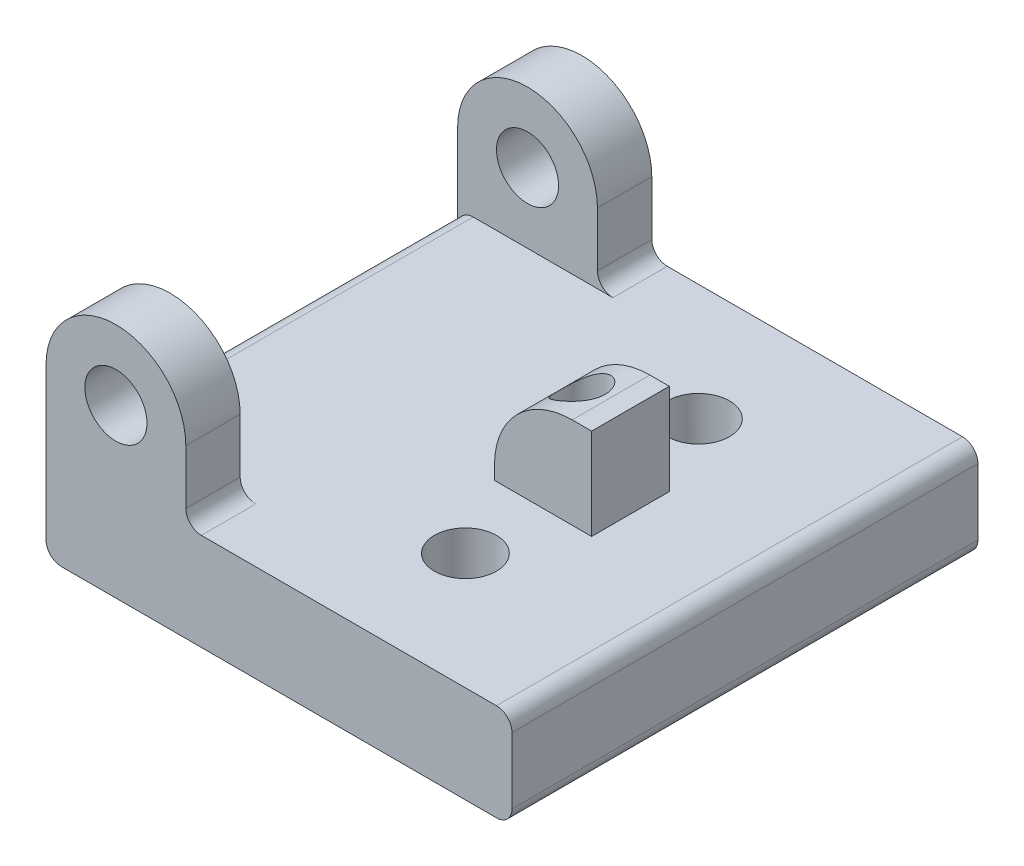
ISO-10303-21;
HEADER;
FILE_DESCRIPTION(('STEP AP214'),'2;1');
FILE_NAME('part.step','',(''),(''),'','','');
FILE_SCHEMA(('AUTOMOTIVE_DESIGN { 1 0 10303 214 1 1 1 1 }'));
ENDSEC;
DATA;
#1=APPLICATION_CONTEXT('core data for automotive mechanical design processes');
#2=APPLICATION_PROTOCOL_DEFINITION('international standard','automotive_design',2000,#1);
#3=PRODUCT_CONTEXT('',#1,'mechanical');
#4=PRODUCT('Part','Part','',(#3));
#5=PRODUCT_RELATED_PRODUCT_CATEGORY('part','',(#4));
#6=PRODUCT_DEFINITION_FORMATION('','',#4);
#7=PRODUCT_DEFINITION_CONTEXT('part definition',#1,'design');
#8=PRODUCT_DEFINITION('design','',#6,#7);
#9=PRODUCT_DEFINITION_SHAPE('','',#8);
#10=(LENGTH_UNIT() NAMED_UNIT(*) SI_UNIT(.MILLI.,.METRE.));
#11=(NAMED_UNIT(*) PLANE_ANGLE_UNIT() SI_UNIT($,.RADIAN.));
#12=(NAMED_UNIT(*) SI_UNIT($,.STERADIAN.) SOLID_ANGLE_UNIT());
#13=UNCERTAINTY_MEASURE_WITH_UNIT(LENGTH_MEASURE(1.E-05),#10,'distance_accuracy_value','');
#14=(GEOMETRIC_REPRESENTATION_CONTEXT(3) GLOBAL_UNCERTAINTY_ASSIGNED_CONTEXT((#13)) GLOBAL_UNIT_ASSIGNED_CONTEXT((#10,
#11,#12)) REPRESENTATION_CONTEXT('',''));
#15=CARTESIAN_POINT('',(0.,0.,0.));
#16=DIRECTION('',(0.,0.,1.));
#17=DIRECTION('',(1.,0.,0.));
#18=AXIS2_PLACEMENT_3D('',#15,#16,#17);
#19=CARTESIAN_POINT('',(19.,0.750000000000012,-7.));
#20=DIRECTION('',(0.,1.,0.));
#21=DIRECTION('',(-1.,0.,0.));
#22=AXIS2_PLACEMENT_3D('',#19,#20,#21);
#23=PLANE('',#22);
#24=CARTESIAN_POINT('',(0.,0.750000000000006,-45.));
#25=DIRECTION('',(0.,1.,0.));
#26=DIRECTION('',(-1.,0.,0.));
#27=AXIS2_PLACEMENT_3D('',#24,#25,#26);
#28=CIRCLE('',#27,4.);
#29=CARTESIAN_POINT('',(-4.,0.750000000000004,-45.));
#30=VERTEX_POINT('',#29);
#31=EDGE_CURVE('E225',#30,#30,#28,.T.);
#32=ORIENTED_EDGE('',*,*,#31,.F.);
#33=EDGE_LOOP('',(#32));
#34=FACE_BOUND('',#33,.T.);
#35=CARTESIAN_POINT('',(0.,0.750000000000006,-15.));
#36=DIRECTION('',(0.,1.,0.));
#37=DIRECTION('',(-1.,0.,0.));
#38=AXIS2_PLACEMENT_3D('',#35,#36,#37);
#39=CIRCLE('',#38,4.);
#40=CARTESIAN_POINT('',(-4.,0.750000000000004,-15.));
#41=VERTEX_POINT('',#40);
#42=EDGE_CURVE('E220',#41,#41,#39,.T.);
#43=ORIENTED_EDGE('',*,*,#42,.F.);
#44=EDGE_LOOP('',(#43));
#45=FACE_BOUND('',#44,.T.);
#46=DIRECTION('',(-1.,0.,0.));
#47=VECTOR('',#46,1.);
#48=CARTESIAN_POINT('',(19.,0.750000000000012,0.));
#49=LINE('',#48,#47);
#50=CARTESIAN_POINT('',(19.,0.750000000000012,0.));
#51=VERTEX_POINT('',#50);
#52=CARTESIAN_POINT('',(-19.,0.749999999999998,0.));
#53=VERTEX_POINT('',#52);
#54=EDGE_CURVE('E338',#51,#53,#49,.T.);
#55=ORIENTED_EDGE('',*,*,#54,.F.);
#56=DIRECTION('',(0.,0.,1.));
#57=VECTOR('',#56,1.);
#58=CARTESIAN_POINT('',(19.,0.750000000000012,-7.));
#59=LINE('',#58,#57);
#60=CARTESIAN_POINT('',(19.,0.750000000000012,-60.));
#61=VERTEX_POINT('',#60);
#62=EDGE_CURVE('E353',#61,#51,#59,.T.);
#63=ORIENTED_EDGE('',*,*,#62,.F.);
#64=DIRECTION('',(-1.,0.,0.));
#65=VECTOR('',#64,1.);
#66=CARTESIAN_POINT('',(19.,0.750000000000012,-60.));
#67=LINE('',#66,#65);
#68=CARTESIAN_POINT('',(-19.,0.749999999999998,-60.));
#69=VERTEX_POINT('',#68);
#70=EDGE_CURVE('E253',#61,#69,#67,.T.);
#71=ORIENTED_EDGE('',*,*,#70,.T.);
#72=DIRECTION('',(0.,0.,-1.));
#73=VECTOR('',#72,1.);
#74=CARTESIAN_POINT('',(-19.,0.749999999999998,-53.));
#75=LINE('',#74,#73);
#76=CARTESIAN_POINT('',(-19.,0.749999999999997,-53.));
#77=VERTEX_POINT('',#76);
#78=EDGE_CURVE('E276',#77,#69,#75,.T.);
#79=ORIENTED_EDGE('',*,*,#78,.F.);
#80=DIRECTION('',(1.,0.,0.));
#81=VECTOR('',#80,1.);
#82=CARTESIAN_POINT('',(-19.,0.749999999999997,-53.));
#83=LINE('',#82,#81);
#84=CARTESIAN_POINT('',(-37.,0.749999999999998,-53.));
#85=VERTEX_POINT('',#84);
#86=EDGE_CURVE('E286',#85,#77,#83,.T.);
#87=ORIENTED_EDGE('',*,*,#86,.F.);
#88=DIRECTION('',(0.,0.,1.));
#89=VECTOR('',#88,1.);
#90=CARTESIAN_POINT('',(-37.,0.749999999999998,-30.));
#91=LINE('',#90,#89);
#92=CARTESIAN_POINT('',(-37.,0.749999999999998,-7.));
#93=VERTEX_POINT('',#92);
#94=EDGE_CURVE('E295',#85,#93,#91,.T.);
#95=ORIENTED_EDGE('',*,*,#94,.T.);
#96=DIRECTION('',(1.,0.,0.));
#97=VECTOR('',#96,1.);
#98=CARTESIAN_POINT('',(-19.,0.749999999999997,-7.));
#99=LINE('',#98,#97);
#100=CARTESIAN_POINT('',(-19.,0.749999999999998,-7.));
#101=VERTEX_POINT('',#100);
#102=EDGE_CURVE('E291',#93,#101,#99,.T.);
#103=ORIENTED_EDGE('',*,*,#102,.T.);
#104=DIRECTION('',(0.,0.,1.));
#105=VECTOR('',#104,1.);
#106=CARTESIAN_POINT('',(-19.,0.749999999999998,-7.));
#107=LINE('',#106,#105);
#108=EDGE_CURVE('E351',#101,#53,#107,.T.);
#109=ORIENTED_EDGE('',*,*,#108,.T.);
#110=EDGE_LOOP('',(#55,#63,#71,#79,#87,#95,#103,#109));
#111=FACE_BOUND('',#110,.T.);
#112=DIRECTION('',(-1.,0.,0.));
#113=VECTOR('',#112,1.);
#114=CARTESIAN_POINT('',(19.,0.750000000000012,-25.));
#115=LINE('',#114,#113);
#116=CARTESIAN_POINT('',(6.25,0.750000000000008,-25.));
#117=VERTEX_POINT('',#116);
#118=CARTESIAN_POINT('',(-6.25,0.750000000000006,-25.));
#119=VERTEX_POINT('',#118);
#120=EDGE_CURVE('E198',#117,#119,#115,.T.);
#121=ORIENTED_EDGE('',*,*,#120,.T.);
#122=DIRECTION('',(0.,0.,-1.));
#123=VECTOR('',#122,1.);
#124=CARTESIAN_POINT('',(-6.25,0.750000000000003,-7.));
#125=LINE('',#124,#123);
#126=CARTESIAN_POINT('',(-6.25,0.750000000000006,-35.));
#127=VERTEX_POINT('',#126);
#128=EDGE_CURVE('E371',#119,#127,#125,.T.);
#129=ORIENTED_EDGE('',*,*,#128,.T.);
#130=DIRECTION('',(1.,0.,0.));
#131=VECTOR('',#130,1.);
#132=CARTESIAN_POINT('',(19.,0.750000000000012,-35.));
#133=LINE('',#132,#131);
#134=CARTESIAN_POINT('',(6.25,0.750000000000008,-35.));
#135=VERTEX_POINT('',#134);
#136=EDGE_CURVE('E348',#127,#135,#133,.T.);
#137=ORIENTED_EDGE('',*,*,#136,.T.);
#138=DIRECTION('',(0.,0.,1.));
#139=VECTOR('',#138,1.);
#140=CARTESIAN_POINT('',(6.25,0.750000000000008,-7.));
#141=LINE('',#140,#139);
#142=EDGE_CURVE('E368',#135,#117,#141,.T.);
#143=ORIENTED_EDGE('',*,*,#142,.T.);
#144=EDGE_LOOP('',(#121,#129,#137,#143));
#145=FACE_BOUND('',#144,.T.);
#146=ADVANCED_FACE('F38',(#34,#45,#111,#145),#23,.T.);
#147=CARTESIAN_POINT('',(-30.,9.75,-7.));
#148=DIRECTION('',(0.,0.,1.));
#149=DIRECTION('',(1.,0.,0.));
#150=AXIS2_PLACEMENT_3D('',#147,#148,#149);
#151=PLANE('',#150);
#152=CARTESIAN_POINT('',(-30.,9.75,-7.));
#153=DIRECTION('',(0.,0.,1.));
#154=DIRECTION('',(1.,0.,0.));
#155=AXIS2_PLACEMENT_3D('',#152,#153,#154);
#156=CIRCLE('',#155,4.);
#157=CARTESIAN_POINT('',(-26.,9.75,-7.));
#158=VERTEX_POINT('',#157);
#159=EDGE_CURVE('E298',#158,#158,#156,.T.);
#160=ORIENTED_EDGE('',*,*,#159,.T.);
#161=EDGE_LOOP('',(#160));
#162=FACE_BOUND('',#161,.T.);
#163=CARTESIAN_POINT('',(-37.,-1.25000000000001,-7.));
#164=DIRECTION('',(0.,0.,-1.));
#165=DIRECTION('',(1.,0.,0.));
#166=AXIS2_PLACEMENT_3D('',#163,#164,#165);
#167=CIRCLE('',#166,2.);
#168=CARTESIAN_POINT('',(-39.,-1.24999999999999,-7.));
#169=VERTEX_POINT('',#168);
#170=EDGE_CURVE('E288',#169,#93,#167,.T.);
#171=ORIENTED_EDGE('',*,*,#170,.F.);
#172=DIRECTION('',(0.,-1.,0.));
#173=VECTOR('',#172,1.);
#174=CARTESIAN_POINT('',(-39.,9.75,-7.));
#175=LINE('',#174,#173);
#176=CARTESIAN_POINT('',(-39.,9.75,-7.));
#177=VERTEX_POINT('',#176);
#178=EDGE_CURVE('E307',#177,#169,#175,.T.);
#179=ORIENTED_EDGE('',*,*,#178,.F.);
#180=CARTESIAN_POINT('',(-30.,9.75,-7.));
#181=DIRECTION('',(0.,0.,1.));
#182=DIRECTION('',(1.,0.,0.));
#183=AXIS2_PLACEMENT_3D('',#180,#181,#182);
#184=CIRCLE('',#183,8.99999999999999);
#185=CARTESIAN_POINT('',(-21.,9.75,-7.));
#186=VERTEX_POINT('',#185);
#187=EDGE_CURVE('E304',#186,#177,#184,.T.);
#188=ORIENTED_EDGE('',*,*,#187,.F.);
#189=DIRECTION('',(0.,1.,0.));
#190=VECTOR('',#189,1.);
#191=CARTESIAN_POINT('',(-21.,2.75,-7.));
#192=LINE('',#191,#190);
#193=CARTESIAN_POINT('',(-21.,2.75,-7.));
#194=VERTEX_POINT('',#193);
#195=EDGE_CURVE('E314',#194,#186,#192,.T.);
#196=ORIENTED_EDGE('',*,*,#195,.F.);
#197=CARTESIAN_POINT('',(-19.,2.75,-7.));
#198=DIRECTION('',(0.,0.,-1.));
#199=DIRECTION('',(-1.,0.,0.));
#200=AXIS2_PLACEMENT_3D('',#197,#198,#199);
#201=CIRCLE('',#200,2.);
#202=EDGE_CURVE('E311',#101,#194,#201,.T.);
#203=ORIENTED_EDGE('',*,*,#202,.F.);
#204=ORIENTED_EDGE('',*,*,#102,.F.);
#205=EDGE_LOOP('',(#171,#179,#188,#196,#203,#204));
#206=FACE_BOUND('',#205,.T.);
#207=ADVANCED_FACE('F396',(#162,#206),#151,.F.);
#208=CARTESIAN_POINT('',(-30.,9.75,-7.));
#209=DIRECTION('',(0.,0.,1.));
#210=DIRECTION('',(1.,0.,0.));
#211=AXIS2_PLACEMENT_3D('',#208,#209,#210);
#212=CYLINDRICAL_SURFACE('',#211,8.99999999999999);
#213=CARTESIAN_POINT('',(-30.,9.75,0.));
#214=DIRECTION('',(0.,0.,1.));
#215=DIRECTION('',(1.,0.,0.));
#216=AXIS2_PLACEMENT_3D('',#213,#214,#215);
#217=CIRCLE('',#216,8.99999999999999);
#218=CARTESIAN_POINT('',(-21.,9.75,0.));
#219=VERTEX_POINT('',#218);
#220=CARTESIAN_POINT('',(-39.,9.75,0.));
#221=VERTEX_POINT('',#220);
#222=EDGE_CURVE('E301',#219,#221,#217,.T.);
#223=ORIENTED_EDGE('',*,*,#222,.F.);
#224=DIRECTION('',(0.,0.,1.));
#225=VECTOR('',#224,1.);
#226=CARTESIAN_POINT('',(-21.,9.75,-7.));
#227=LINE('',#226,#225);
#228=EDGE_CURVE('E346',#186,#219,#227,.T.);
#229=ORIENTED_EDGE('',*,*,#228,.F.);
#230=ORIENTED_EDGE('',*,*,#187,.T.);
#231=DIRECTION('',(0.,0.,1.));
#232=VECTOR('',#231,1.);
#233=CARTESIAN_POINT('',(-39.,9.75,-7.));
#234=LINE('',#233,#232);
#235=EDGE_CURVE('E317',#177,#221,#234,.T.);
#236=ORIENTED_EDGE('',*,*,#235,.T.);
#237=EDGE_LOOP('',(#223,#229,#230,#236));
#238=FACE_BOUND('',#237,.T.);
#239=ADVANCED_FACE('F402',(#238),#212,.T.);
#240=CARTESIAN_POINT('',(-21.,2.75,-7.));
#241=DIRECTION('',(1.,0.,0.));
#242=DIRECTION('',(0.,0.,-1.));
#243=AXIS2_PLACEMENT_3D('',#240,#241,#242);
#244=PLANE('',#243);
#245=DIRECTION('',(0.,1.,0.));
#246=VECTOR('',#245,1.);
#247=CARTESIAN_POINT('',(-21.,2.75,0.));
#248=LINE('',#247,#246);
#249=CARTESIAN_POINT('',(-21.,2.75,0.));
#250=VERTEX_POINT('',#249);
#251=EDGE_CURVE('E308',#250,#219,#248,.T.);
#252=ORIENTED_EDGE('',*,*,#251,.F.);
#253=DIRECTION('',(0.,0.,1.));
#254=VECTOR('',#253,1.);
#255=CARTESIAN_POINT('',(-21.,2.75,-7.));
#256=LINE('',#255,#254);
#257=EDGE_CURVE('E349',#194,#250,#256,.T.);
#258=ORIENTED_EDGE('',*,*,#257,.F.);
#259=ORIENTED_EDGE('',*,*,#195,.T.);
#260=ORIENTED_EDGE('',*,*,#228,.T.);
#261=EDGE_LOOP('',(#252,#258,#259,#260));
#262=FACE_BOUND('',#261,.T.);
#263=ADVANCED_FACE('F436',(#262),#244,.T.);
#264=CARTESIAN_POINT('',(-19.,2.75,-7.));
#265=DIRECTION('',(0.,0.,1.));
#266=DIRECTION('',(1.,0.,0.));
#267=AXIS2_PLACEMENT_3D('',#264,#265,#266);
#268=CYLINDRICAL_SURFACE('',#267,2.);
#269=CARTESIAN_POINT('',(-19.,2.75,0.));
#270=DIRECTION('',(0.,0.,-1.));
#271=DIRECTION('',(-1.,0.,0.));
#272=AXIS2_PLACEMENT_3D('',#269,#270,#271);
#273=CIRCLE('',#272,2.);
#274=EDGE_CURVE('E341',#53,#250,#273,.T.);
#275=ORIENTED_EDGE('',*,*,#274,.F.);
#276=ORIENTED_EDGE('',*,*,#108,.F.);
#277=ORIENTED_EDGE('',*,*,#202,.T.);
#278=ORIENTED_EDGE('',*,*,#257,.T.);
#279=EDGE_LOOP('',(#275,#276,#277,#278));
#280=FACE_BOUND('',#279,.T.);
#281=ADVANCED_FACE('F409',(#280),#268,.F.);
#282=CARTESIAN_POINT('',(19.,-1.24999999999999,-7.));
#283=DIRECTION('',(0.,0.,1.));
#284=DIRECTION('',(1.,0.,0.));
#285=AXIS2_PLACEMENT_3D('',#282,#283,#284);
#286=CYLINDRICAL_SURFACE('',#285,2.);
#287=CARTESIAN_POINT('',(19.,-1.24999999999999,0.));
#288=DIRECTION('',(0.,0.,1.));
#289=DIRECTION('',(1.,0.,0.));
#290=AXIS2_PLACEMENT_3D('',#287,#288,#289);
#291=CIRCLE('',#290,2.);
#292=CARTESIAN_POINT('',(21.,-1.24999999999999,0.));
#293=VERTEX_POINT('',#292);
#294=EDGE_CURVE('E335',#293,#51,#291,.T.);
#295=ORIENTED_EDGE('',*,*,#294,.F.);
#296=DIRECTION('',(0.,0.,1.));
#297=VECTOR('',#296,1.);
#298=CARTESIAN_POINT('',(21.,-1.24999999999999,-7.));
#299=LINE('',#298,#297);
#300=CARTESIAN_POINT('',(21.,-1.24999999999999,-60.));
#301=VERTEX_POINT('',#300);
#302=EDGE_CURVE('E355',#301,#293,#299,.T.);
#303=ORIENTED_EDGE('',*,*,#302,.F.);
#304=CARTESIAN_POINT('',(19.,-1.24999999999999,-60.));
#305=DIRECTION('',(0.,0.,1.));
#306=DIRECTION('',(1.,0.,0.));
#307=AXIS2_PLACEMENT_3D('',#304,#305,#306);
#308=CIRCLE('',#307,2.);
#309=EDGE_CURVE('E255',#301,#61,#308,.T.);
#310=ORIENTED_EDGE('',*,*,#309,.T.);
#311=ORIENTED_EDGE('',*,*,#62,.T.);
#312=EDGE_LOOP('',(#295,#303,#310,#311));
#313=FACE_BOUND('',#312,.T.);
#314=ADVANCED_FACE('F411',(#313),#286,.T.);
#315=CARTESIAN_POINT('',(21.,-9.75,-7.));
#316=DIRECTION('',(1.,0.,0.));
#317=DIRECTION('',(0.,0.,-1.));
#318=AXIS2_PLACEMENT_3D('',#315,#316,#317);
#319=PLANE('',#318);
#320=DIRECTION('',(0.,1.,0.));
#321=VECTOR('',#320,1.);
#322=CARTESIAN_POINT('',(21.,-9.75,0.));
#323=LINE('',#322,#321);
#324=CARTESIAN_POINT('',(21.,-9.75,0.));
#325=VERTEX_POINT('',#324);
#326=EDGE_CURVE('E332',#325,#293,#323,.T.);
#327=ORIENTED_EDGE('',*,*,#326,.F.);
#328=DIRECTION('',(0.,0.,1.));
#329=VECTOR('',#328,1.);
#330=CARTESIAN_POINT('',(21.,-9.75,-7.));
#331=LINE('',#330,#329);
#332=CARTESIAN_POINT('',(21.,-9.75,-60.));
#333=VERTEX_POINT('',#332);
#334=EDGE_CURVE('E357',#333,#325,#331,.T.);
#335=ORIENTED_EDGE('',*,*,#334,.F.);
#336=DIRECTION('',(0.,1.,0.));
#337=VECTOR('',#336,1.);
#338=CARTESIAN_POINT('',(21.,-9.75,-60.));
#339=LINE('',#338,#337);
#340=EDGE_CURVE('E258',#333,#301,#339,.T.);
#341=ORIENTED_EDGE('',*,*,#340,.T.);
#342=ORIENTED_EDGE('',*,*,#302,.T.);
#343=EDGE_LOOP('',(#327,#335,#341,#342));
#344=FACE_BOUND('',#343,.T.);
#345=ADVANCED_FACE('F414',(#344),#319,.T.);
#346=CARTESIAN_POINT('',(19.,-9.75,-7.));
#347=DIRECTION('',(0.,0.,1.));
#348=DIRECTION('',(1.,0.,0.));
#349=AXIS2_PLACEMENT_3D('',#346,#347,#348);
#350=CYLINDRICAL_SURFACE('',#349,2.);
#351=CARTESIAN_POINT('',(19.,-9.75,0.));
#352=DIRECTION('',(0.,0.,1.));
#353=DIRECTION('',(1.,0.,0.));
#354=AXIS2_PLACEMENT_3D('',#351,#352,#353);
#355=CIRCLE('',#354,2.);
#356=CARTESIAN_POINT('',(19.,-11.75,0.));
#357=VERTEX_POINT('',#356);
#358=EDGE_CURVE('E329',#357,#325,#355,.T.);
#359=ORIENTED_EDGE('',*,*,#358,.F.);
#360=DIRECTION('',(0.,0.,1.));
#361=VECTOR('',#360,1.);
#362=CARTESIAN_POINT('',(19.,-11.75,-7.));
#363=LINE('',#362,#361);
#364=CARTESIAN_POINT('',(19.,-11.75,-60.));
#365=VERTEX_POINT('',#364);
#366=EDGE_CURVE('E359',#365,#357,#363,.T.);
#367=ORIENTED_EDGE('',*,*,#366,.F.);
#368=CARTESIAN_POINT('',(19.,-9.75,-60.));
#369=DIRECTION('',(0.,0.,1.));
#370=DIRECTION('',(1.,0.,0.));
#371=AXIS2_PLACEMENT_3D('',#368,#369,#370);
#372=CIRCLE('',#371,2.);
#373=EDGE_CURVE('E261',#365,#333,#372,.T.);
#374=ORIENTED_EDGE('',*,*,#373,.T.);
#375=ORIENTED_EDGE('',*,*,#334,.T.);
#376=EDGE_LOOP('',(#359,#367,#374,#375));
#377=FACE_BOUND('',#376,.T.);
#378=ADVANCED_FACE('F418',(#377),#350,.T.);
#379=CARTESIAN_POINT('',(-37.,-11.75,-7.));
#380=DIRECTION('',(0.,-1.,0.));
#381=DIRECTION('',(1.,0.,0.));
#382=AXIS2_PLACEMENT_3D('',#379,#380,#381);
#383=PLANE('',#382);
#384=CARTESIAN_POINT('',(0.,-11.75,-45.));
#385=DIRECTION('',(0.,1.,0.));
#386=DIRECTION('',(0.,0.,1.));
#387=AXIS2_PLACEMENT_3D('',#384,#385,#386);
#388=CIRCLE('',#387,4.);
#389=CARTESIAN_POINT('',(0.,-11.75,-41.));
#390=VERTEX_POINT('',#389);
#391=EDGE_CURVE('E217',#390,#390,#388,.T.);
#392=ORIENTED_EDGE('',*,*,#391,.T.);
#393=EDGE_LOOP('',(#392));
#394=FACE_BOUND('',#393,.T.);
#395=CARTESIAN_POINT('',(0.,-11.75,-15.));
#396=DIRECTION('',(0.,1.,0.));
#397=DIRECTION('',(0.,0.,1.));
#398=AXIS2_PLACEMENT_3D('',#395,#396,#397);
#399=CIRCLE('',#398,4.);
#400=CARTESIAN_POINT('',(0.,-11.75,-11.));
#401=VERTEX_POINT('',#400);
#402=EDGE_CURVE('E216',#401,#401,#399,.T.);
#403=ORIENTED_EDGE('',*,*,#402,.T.);
#404=EDGE_LOOP('',(#403));
#405=FACE_BOUND('',#404,.T.);
#406=DIRECTION('',(1.,0.,0.));
#407=VECTOR('',#406,1.);
#408=CARTESIAN_POINT('',(-37.,-11.75,0.));
#409=LINE('',#408,#407);
#410=CARTESIAN_POINT('',(-37.,-11.75,0.));
#411=VERTEX_POINT('',#410);
#412=EDGE_CURVE('E326',#411,#357,#409,.T.);
#413=ORIENTED_EDGE('',*,*,#412,.F.);
#414=DIRECTION('',(0.,0.,1.));
#415=VECTOR('',#414,1.);
#416=CARTESIAN_POINT('',(-37.,-11.75,-7.));
#417=LINE('',#416,#415);
#418=CARTESIAN_POINT('',(-37.,-11.75,-60.));
#419=VERTEX_POINT('',#418);
#420=EDGE_CURVE('E361',#419,#411,#417,.T.);
#421=ORIENTED_EDGE('',*,*,#420,.F.);
#422=DIRECTION('',(1.,0.,0.));
#423=VECTOR('',#422,1.);
#424=CARTESIAN_POINT('',(-37.,-11.75,-60.));
#425=LINE('',#424,#423);
#426=EDGE_CURVE('E264',#419,#365,#425,.T.);
#427=ORIENTED_EDGE('',*,*,#426,.T.);
#428=ORIENTED_EDGE('',*,*,#366,.T.);
#429=EDGE_LOOP('',(#413,#421,#427,#428));
#430=FACE_BOUND('',#429,.T.);
#431=ADVANCED_FACE('F422',(#394,#405,#430),#383,.T.);
#432=CARTESIAN_POINT('',(-37.,-9.75000000000001,-7.));
#433=DIRECTION('',(0.,0.,1.));
#434=DIRECTION('',(1.,0.,0.));
#435=AXIS2_PLACEMENT_3D('',#432,#433,#434);
#436=CYLINDRICAL_SURFACE('',#435,2.);
#437=CARTESIAN_POINT('',(-37.,-9.75000000000001,0.));
#438=DIRECTION('',(0.,0.,1.));
#439=DIRECTION('',(1.,0.,0.));
#440=AXIS2_PLACEMENT_3D('',#437,#438,#439);
#441=CIRCLE('',#440,2.);
#442=CARTESIAN_POINT('',(-39.,-9.75000000000001,0.));
#443=VERTEX_POINT('',#442);
#444=EDGE_CURVE('E323',#443,#411,#441,.T.);
#445=ORIENTED_EDGE('',*,*,#444,.F.);
#446=DIRECTION('',(0.,0.,1.));
#447=VECTOR('',#446,1.);
#448=CARTESIAN_POINT('',(-39.,-9.75000000000001,-7.));
#449=LINE('',#448,#447);
#450=CARTESIAN_POINT('',(-39.,-9.75000000000001,-60.));
#451=VERTEX_POINT('',#450);
#452=EDGE_CURVE('E363',#451,#443,#449,.T.);
#453=ORIENTED_EDGE('',*,*,#452,.F.);
#454=CARTESIAN_POINT('',(-37.,-9.75000000000001,-60.));
#455=DIRECTION('',(0.,0.,1.));
#456=DIRECTION('',(1.,0.,0.));
#457=AXIS2_PLACEMENT_3D('',#454,#455,#456);
#458=CIRCLE('',#457,2.);
#459=EDGE_CURVE('E267',#451,#419,#458,.T.);
#460=ORIENTED_EDGE('',*,*,#459,.T.);
#461=ORIENTED_EDGE('',*,*,#420,.T.);
#462=EDGE_LOOP('',(#445,#453,#460,#461));
#463=FACE_BOUND('',#462,.T.);
#464=ADVANCED_FACE('F426',(#463),#436,.T.);
#465=CARTESIAN_POINT('',(-39.,9.75,-7.));
#466=DIRECTION('',(-1.,0.,0.));
#467=DIRECTION('',(0.,-1.,0.));
#468=AXIS2_PLACEMENT_3D('',#465,#466,#467);
#469=PLANE('',#468);
#470=DIRECTION('',(0.,-1.,0.));
#471=VECTOR('',#470,1.);
#472=CARTESIAN_POINT('',(-39.,9.75,0.));
#473=LINE('',#472,#471);
#474=EDGE_CURVE('E320',#221,#443,#473,.T.);
#475=ORIENTED_EDGE('',*,*,#474,.F.);
#476=ORIENTED_EDGE('',*,*,#235,.F.);
#477=ORIENTED_EDGE('',*,*,#178,.T.);
#478=DIRECTION('',(0.,0.,1.));
#479=VECTOR('',#478,1.);
#480=CARTESIAN_POINT('',(-39.,-1.24999999999999,-30.));
#481=LINE('',#480,#479);
#482=CARTESIAN_POINT('',(-39.,-1.24999999999999,-53.));
#483=VERTEX_POINT('',#482);
#484=EDGE_CURVE('E293',#483,#169,#481,.T.);
#485=ORIENTED_EDGE('',*,*,#484,.F.);
#486=DIRECTION('',(0.,-1.,0.));
#487=VECTOR('',#486,1.);
#488=CARTESIAN_POINT('',(-39.,9.75,-53.));
#489=LINE('',#488,#487);
#490=CARTESIAN_POINT('',(-39.,9.75,-53.));
#491=VERTEX_POINT('',#490);
#492=EDGE_CURVE('E243',#491,#483,#489,.T.);
#493=ORIENTED_EDGE('',*,*,#492,.F.);
#494=DIRECTION('',(0.,0.,-1.));
#495=VECTOR('',#494,1.);
#496=CARTESIAN_POINT('',(-39.,9.75,-53.));
#497=LINE('',#496,#495);
#498=CARTESIAN_POINT('',(-39.,9.75,-60.));
#499=VERTEX_POINT('',#498);
#500=EDGE_CURVE('E272',#491,#499,#497,.T.);
#501=ORIENTED_EDGE('',*,*,#500,.T.);
#502=DIRECTION('',(0.,-1.,0.));
#503=VECTOR('',#502,1.);
#504=CARTESIAN_POINT('',(-39.,9.75,-60.));
#505=LINE('',#504,#503);
#506=EDGE_CURVE('E239',#499,#451,#505,.T.);
#507=ORIENTED_EDGE('',*,*,#506,.T.);
#508=ORIENTED_EDGE('',*,*,#452,.T.);
#509=EDGE_LOOP('',(#475,#476,#477,#485,#493,#501,#507,#508));
#510=FACE_BOUND('',#509,.T.);
#511=ADVANCED_FACE('F430',(#510),#469,.T.);
#512=CARTESIAN_POINT('',(-30.,9.75,0.));
#513=DIRECTION('',(0.,0.,1.));
#514=DIRECTION('',(1.,0.,0.));
#515=AXIS2_PLACEMENT_3D('',#512,#513,#514);
#516=PLANE('',#515);
#517=CARTESIAN_POINT('',(-30.,9.75,0.));
#518=DIRECTION('',(0.,0.,1.));
#519=DIRECTION('',(1.,0.,0.));
#520=AXIS2_PLACEMENT_3D('',#517,#518,#519);
#521=CIRCLE('',#520,4.);
#522=CARTESIAN_POINT('',(-26.,9.75,0.));
#523=VERTEX_POINT('',#522);
#524=EDGE_CURVE('E297',#523,#523,#521,.T.);
#525=ORIENTED_EDGE('',*,*,#524,.F.);
#526=EDGE_LOOP('',(#525));
#527=FACE_BOUND('',#526,.T.);
#528=ORIENTED_EDGE('',*,*,#222,.T.);
#529=ORIENTED_EDGE('',*,*,#474,.T.);
#530=ORIENTED_EDGE('',*,*,#444,.T.);
#531=ORIENTED_EDGE('',*,*,#412,.T.);
#532=ORIENTED_EDGE('',*,*,#358,.T.);
#533=ORIENTED_EDGE('',*,*,#326,.T.);
#534=ORIENTED_EDGE('',*,*,#294,.T.);
#535=ORIENTED_EDGE('',*,*,#54,.T.);
#536=ORIENTED_EDGE('',*,*,#274,.T.);
#537=ORIENTED_EDGE('',*,*,#251,.T.);
#538=EDGE_LOOP('',(#528,#529,#530,#531,#532,#533,#534,#535,#536,#537));
#539=FACE_BOUND('',#538,.T.);
#540=ADVANCED_FACE('F433',(#527,#539),#516,.T.);
#541=CARTESIAN_POINT('',(-30.,9.75,-7.));
#542=DIRECTION('',(0.,0.,1.));
#543=DIRECTION('',(1.,0.,0.));
#544=AXIS2_PLACEMENT_3D('',#541,#542,#543);
#545=CYLINDRICAL_SURFACE('',#544,4.);
#546=ORIENTED_EDGE('',*,*,#159,.F.);
#547=EDGE_LOOP('',(#546));
#548=FACE_BOUND('',#547,.T.);
#549=ORIENTED_EDGE('',*,*,#524,.T.);
#550=EDGE_LOOP('',(#549));
#551=FACE_BOUND('',#550,.T.);
#552=ADVANCED_FACE('F510',(#548,#551),#545,.F.);
#553=CARTESIAN_POINT('',(-37.,-1.25000000000001,-30.));
#554=DIRECTION('',(0.,0.,1.));
#555=DIRECTION('',(1.,0.,0.));
#556=AXIS2_PLACEMENT_3D('',#553,#554,#555);
#557=CYLINDRICAL_SURFACE('',#556,2.);
#558=ORIENTED_EDGE('',*,*,#170,.T.);
#559=ORIENTED_EDGE('',*,*,#94,.F.);
#560=CARTESIAN_POINT('',(-37.,-1.25000000000001,-53.));
#561=DIRECTION('',(0.,0.,-1.));
#562=DIRECTION('',(1.,0.,0.));
#563=AXIS2_PLACEMENT_3D('',#560,#561,#562);
#564=CIRCLE('',#563,2.);
#565=EDGE_CURVE('E275',#483,#85,#564,.T.);
#566=ORIENTED_EDGE('',*,*,#565,.F.);
#567=ORIENTED_EDGE('',*,*,#484,.T.);
#568=EDGE_LOOP('',(#558,#559,#566,#567));
#569=FACE_BOUND('',#568,.T.);
#570=ADVANCED_FACE('F518',(#569),#557,.T.);
#571=CARTESIAN_POINT('',(-30.,9.75,-53.));
#572=DIRECTION('',(0.,0.,-1.));
#573=DIRECTION('',(1.,0.,0.));
#574=AXIS2_PLACEMENT_3D('',#571,#572,#573);
#575=PLANE('',#574);
#576=ORIENTED_EDGE('',*,*,#492,.T.);
#577=ORIENTED_EDGE('',*,*,#565,.T.);
#578=ORIENTED_EDGE('',*,*,#86,.T.);
#579=CARTESIAN_POINT('',(-19.,2.75,-53.));
#580=DIRECTION('',(0.,0.,-1.));
#581=DIRECTION('',(-1.,0.,0.));
#582=AXIS2_PLACEMENT_3D('',#579,#580,#581);
#583=CIRCLE('',#582,2.);
#584=CARTESIAN_POINT('',(-21.,2.75,-53.));
#585=VERTEX_POINT('',#584);
#586=EDGE_CURVE('E241',#77,#585,#583,.T.);
#587=ORIENTED_EDGE('',*,*,#586,.T.);
#588=DIRECTION('',(0.,1.,0.));
#589=VECTOR('',#588,1.);
#590=CARTESIAN_POINT('',(-21.,2.75,-53.));
#591=LINE('',#590,#589);
#592=CARTESIAN_POINT('',(-21.,9.75,-53.));
#593=VERTEX_POINT('',#592);
#594=EDGE_CURVE('E238',#585,#593,#591,.T.);
#595=ORIENTED_EDGE('',*,*,#594,.T.);
#596=CARTESIAN_POINT('',(-30.,9.75,-53.));
#597=DIRECTION('',(0.,0.,1.));
#598=DIRECTION('',(1.,0.,0.));
#599=AXIS2_PLACEMENT_3D('',#596,#597,#598);
#600=CIRCLE('',#599,8.99999999999999);
#601=EDGE_CURVE('E235',#593,#491,#600,.T.);
#602=ORIENTED_EDGE('',*,*,#601,.T.);
#603=EDGE_LOOP('',(#576,#577,#578,#587,#595,#602));
#604=FACE_BOUND('',#603,.T.);
#605=CARTESIAN_POINT('',(-30.,9.75,-53.));
#606=DIRECTION('',(0.,0.,1.));
#607=DIRECTION('',(1.,0.,0.));
#608=AXIS2_PLACEMENT_3D('',#605,#606,#607);
#609=CIRCLE('',#608,4.);
#610=CARTESIAN_POINT('',(-26.,9.75,-53.));
#611=VERTEX_POINT('',#610);
#612=EDGE_CURVE('E229',#611,#611,#609,.T.);
#613=ORIENTED_EDGE('',*,*,#612,.F.);
#614=EDGE_LOOP('',(#613));
#615=FACE_BOUND('',#614,.T.);
#616=ADVANCED_FACE('F525',(#604,#615),#575,.F.);
#617=CARTESIAN_POINT('',(-30.,9.75,-60.));
#618=DIRECTION('',(0.,0.,-1.));
#619=DIRECTION('',(1.,0.,0.));
#620=AXIS2_PLACEMENT_3D('',#617,#618,#619);
#621=PLANE('',#620);
#622=CARTESIAN_POINT('',(-30.,9.75,-60.));
#623=DIRECTION('',(0.,0.,1.));
#624=DIRECTION('',(1.,0.,0.));
#625=AXIS2_PLACEMENT_3D('',#622,#623,#624);
#626=CIRCLE('',#625,8.99999999999999);
#627=CARTESIAN_POINT('',(-21.,9.75,-60.));
#628=VERTEX_POINT('',#627);
#629=EDGE_CURVE('E232',#628,#499,#626,.T.);
#630=ORIENTED_EDGE('',*,*,#629,.F.);
#631=DIRECTION('',(0.,1.,0.));
#632=VECTOR('',#631,1.);
#633=CARTESIAN_POINT('',(-21.,2.75,-60.));
#634=LINE('',#633,#632);
#635=CARTESIAN_POINT('',(-21.,2.75,-60.));
#636=VERTEX_POINT('',#635);
#637=EDGE_CURVE('E249',#636,#628,#634,.T.);
#638=ORIENTED_EDGE('',*,*,#637,.F.);
#639=CARTESIAN_POINT('',(-19.,2.75,-60.));
#640=DIRECTION('',(0.,0.,-1.));
#641=DIRECTION('',(-1.,0.,0.));
#642=AXIS2_PLACEMENT_3D('',#639,#640,#641);
#643=CIRCLE('',#642,2.);
#644=EDGE_CURVE('E251',#69,#636,#643,.T.);
#645=ORIENTED_EDGE('',*,*,#644,.F.);
#646=ORIENTED_EDGE('',*,*,#70,.F.);
#647=ORIENTED_EDGE('',*,*,#309,.F.);
#648=ORIENTED_EDGE('',*,*,#340,.F.);
#649=ORIENTED_EDGE('',*,*,#373,.F.);
#650=ORIENTED_EDGE('',*,*,#426,.F.);
#651=ORIENTED_EDGE('',*,*,#459,.F.);
#652=ORIENTED_EDGE('',*,*,#506,.F.);
#653=EDGE_LOOP('',(#630,#638,#645,#646,#647,#648,#649,#650,#651,#652));
#654=FACE_BOUND('',#653,.T.);
#655=CARTESIAN_POINT('',(-30.,9.75,-60.));
#656=DIRECTION('',(0.,0.,1.));
#657=DIRECTION('',(1.,0.,0.));
#658=AXIS2_PLACEMENT_3D('',#655,#656,#657);
#659=CIRCLE('',#658,4.);
#660=CARTESIAN_POINT('',(-26.,9.75,-60.));
#661=VERTEX_POINT('',#660);
#662=EDGE_CURVE('E228',#661,#661,#659,.T.);
#663=ORIENTED_EDGE('',*,*,#662,.T.);
#664=EDGE_LOOP('',(#663));
#665=FACE_BOUND('',#664,.T.);
#666=ADVANCED_FACE('F533',(#654,#665),#621,.T.);
#667=CARTESIAN_POINT('',(-30.,9.75,-53.));
#668=DIRECTION('',(0.,0.,-1.));
#669=DIRECTION('',(-1.,0.,0.));
#670=AXIS2_PLACEMENT_3D('',#667,#668,#669);
#671=CYLINDRICAL_SURFACE('',#670,8.99999999999999);
#672=ORIENTED_EDGE('',*,*,#629,.T.);
#673=ORIENTED_EDGE('',*,*,#500,.F.);
#674=ORIENTED_EDGE('',*,*,#601,.F.);
#675=DIRECTION('',(0.,0.,-1.));
#676=VECTOR('',#675,1.);
#677=CARTESIAN_POINT('',(-21.,9.75,-53.));
#678=LINE('',#677,#676);
#679=EDGE_CURVE('E246',#593,#628,#678,.T.);
#680=ORIENTED_EDGE('',*,*,#679,.T.);
#681=EDGE_LOOP('',(#672,#673,#674,#680));
#682=FACE_BOUND('',#681,.T.);
#683=ADVANCED_FACE('F541',(#682),#671,.T.);
#684=CARTESIAN_POINT('',(-19.,2.75,-53.));
#685=DIRECTION('',(0.,0.,-1.));
#686=DIRECTION('',(-1.,0.,0.));
#687=AXIS2_PLACEMENT_3D('',#684,#685,#686);
#688=CYLINDRICAL_SURFACE('',#687,2.);
#689=ORIENTED_EDGE('',*,*,#644,.T.);
#690=DIRECTION('',(0.,0.,-1.));
#691=VECTOR('',#690,1.);
#692=CARTESIAN_POINT('',(-21.,2.75,-53.));
#693=LINE('',#692,#691);
#694=EDGE_CURVE('E279',#585,#636,#693,.T.);
#695=ORIENTED_EDGE('',*,*,#694,.F.);
#696=ORIENTED_EDGE('',*,*,#586,.F.);
#697=ORIENTED_EDGE('',*,*,#78,.T.);
#698=EDGE_LOOP('',(#689,#695,#696,#697));
#699=FACE_BOUND('',#698,.T.);
#700=ADVANCED_FACE('F549',(#699),#688,.F.);
#701=CARTESIAN_POINT('',(-21.,2.75,-53.));
#702=DIRECTION('',(-1.,0.,0.));
#703=DIRECTION('',(0.,0.,1.));
#704=AXIS2_PLACEMENT_3D('',#701,#702,#703);
#705=PLANE('',#704);
#706=ORIENTED_EDGE('',*,*,#637,.T.);
#707=ORIENTED_EDGE('',*,*,#679,.F.);
#708=ORIENTED_EDGE('',*,*,#594,.F.);
#709=ORIENTED_EDGE('',*,*,#694,.T.);
#710=EDGE_LOOP('',(#706,#707,#708,#709));
#711=FACE_BOUND('',#710,.T.);
#712=ADVANCED_FACE('F557',(#711),#705,.F.);
#713=CARTESIAN_POINT('',(-30.,9.75,-53.));
#714=DIRECTION('',(0.,0.,-1.));
#715=DIRECTION('',(-1.,0.,0.));
#716=AXIS2_PLACEMENT_3D('',#713,#714,#715);
#717=CYLINDRICAL_SURFACE('',#716,4.);
#718=ORIENTED_EDGE('',*,*,#612,.T.);
#719=EDGE_LOOP('',(#718));
#720=FACE_BOUND('',#719,.T.);
#721=ORIENTED_EDGE('',*,*,#662,.F.);
#722=EDGE_LOOP('',(#721));
#723=FACE_BOUND('',#722,.T.);
#724=ADVANCED_FACE('F565',(#720,#723),#717,.F.);
#725=CARTESIAN_POINT('',(0.,-11.75,-15.));
#726=DIRECTION('',(0.,1.,0.));
#727=DIRECTION('',(0.,0.,1.));
#728=AXIS2_PLACEMENT_3D('',#725,#726,#727);
#729=CYLINDRICAL_SURFACE('',#728,4.);
#730=ORIENTED_EDGE('',*,*,#42,.T.);
#731=EDGE_LOOP('',(#730));
#732=FACE_BOUND('',#731,.T.);
#733=ORIENTED_EDGE('',*,*,#402,.F.);
#734=EDGE_LOOP('',(#733));
#735=FACE_BOUND('',#734,.T.);
#736=ADVANCED_FACE('F572',(#732,#735),#729,.F.);
#737=CARTESIAN_POINT('',(0.,-11.75,-45.));
#738=DIRECTION('',(0.,1.,0.));
#739=DIRECTION('',(0.,0.,1.));
#740=AXIS2_PLACEMENT_3D('',#737,#738,#739);
#741=CYLINDRICAL_SURFACE('',#740,4.);
#742=ORIENTED_EDGE('',*,*,#31,.T.);
#743=EDGE_LOOP('',(#742));
#744=FACE_BOUND('',#743,.T.);
#745=ORIENTED_EDGE('',*,*,#391,.F.);
#746=EDGE_LOOP('',(#745));
#747=FACE_BOUND('',#746,.T.);
#748=ADVANCED_FACE('F579',(#744,#747),#741,.F.);
#749=CARTESIAN_POINT('',(-6.25,12.5,-35.));
#750=DIRECTION('',(1.,0.,0.));
#751=DIRECTION('',(0.,0.,-1.));
#752=AXIS2_PLACEMENT_3D('',#749,#750,#751);
#753=PLANE('',#752);
#754=DIRECTION('',(0.,-1.,0.));
#755=VECTOR('',#754,1.);
#756=CARTESIAN_POINT('',(-6.25,12.5,-25.));
#757=LINE('',#756,#755);
#758=CARTESIAN_POINT('',(-6.25,2.5,-25.));
#759=VERTEX_POINT('',#758);
#760=EDGE_CURVE('E202',#759,#119,#757,.T.);
#761=ORIENTED_EDGE('',*,*,#760,.F.);
#762=DIRECTION('',(0.,0.,1.));
#763=VECTOR('',#762,1.);
#764=CARTESIAN_POINT('',(-6.25,2.5,-35.));
#765=LINE('',#764,#763);
#766=CARTESIAN_POINT('',(-6.25,2.5,-35.));
#767=VERTEX_POINT('',#766);
#768=EDGE_CURVE('E52',#759,#767,#765,.F.);
#769=ORIENTED_EDGE('',*,*,#768,.T.);
#770=DIRECTION('',(0.,-1.,0.));
#771=VECTOR('',#770,1.);
#772=CARTESIAN_POINT('',(-6.25,12.5,-35.));
#773=LINE('',#772,#771);
#774=EDGE_CURVE('E209',#767,#127,#773,.T.);
#775=ORIENTED_EDGE('',*,*,#774,.T.);
#776=ORIENTED_EDGE('',*,*,#128,.F.);
#777=EDGE_LOOP('',(#761,#769,#775,#776));
#778=FACE_BOUND('',#777,.T.);
#779=ADVANCED_FACE('F379',(#778),#753,.F.);
#780=CARTESIAN_POINT('',(-6.25,12.5,-25.));
#781=DIRECTION('',(0.,0.,-1.));
#782=DIRECTION('',(-1.,0.,0.));
#783=AXIS2_PLACEMENT_3D('',#780,#781,#782);
#784=PLANE('',#783);
#785=DIRECTION('',(1.,0.,0.));
#786=VECTOR('',#785,1.);
#787=CARTESIAN_POINT('',(-6.25,12.5,-25.));
#788=LINE('',#787,#786);
#789=CARTESIAN_POINT('',(3.75,12.5,-25.));
#790=VERTEX_POINT('',#789);
#791=CARTESIAN_POINT('',(6.25,12.5,-25.));
#792=VERTEX_POINT('',#791);
#793=EDGE_CURVE('E184',#790,#792,#788,.T.);
#794=ORIENTED_EDGE('',*,*,#793,.F.);
#795=CARTESIAN_POINT('',(3.75,2.5,-25.));
#796=DIRECTION('',(0.,0.,-1.));
#797=DIRECTION('',(-1.,0.,0.));
#798=AXIS2_PLACEMENT_3D('',#795,#796,#797);
#799=CIRCLE('',#798,10.);
#800=EDGE_CURVE('E66',#790,#759,#799,.F.);
#801=ORIENTED_EDGE('',*,*,#800,.T.);
#802=ORIENTED_EDGE('',*,*,#760,.T.);
#803=ORIENTED_EDGE('',*,*,#120,.F.);
#804=DIRECTION('',(0.,-1.,0.));
#805=VECTOR('',#804,1.);
#806=CARTESIAN_POINT('',(6.25,12.5,-25.));
#807=LINE('',#806,#805);
#808=EDGE_CURVE('E195',#792,#117,#807,.T.);
#809=ORIENTED_EDGE('',*,*,#808,.F.);
#810=EDGE_LOOP('',(#794,#801,#802,#803,#809));
#811=FACE_BOUND('',#810,.T.);
#812=ADVANCED_FACE('F196',(#811),#784,.F.);
#813=CARTESIAN_POINT('',(6.25,12.5,-35.));
#814=DIRECTION('',(-1.,0.,0.));
#815=DIRECTION('',(0.,0.,1.));
#816=AXIS2_PLACEMENT_3D('',#813,#814,#815);
#817=PLANE('',#816);
#818=ORIENTED_EDGE('',*,*,#142,.F.);
#819=DIRECTION('',(0.,-1.,0.));
#820=VECTOR('',#819,1.);
#821=CARTESIAN_POINT('',(6.25,12.5,-35.));
#822=LINE('',#821,#820);
#823=CARTESIAN_POINT('',(6.25,12.5,-35.));
#824=VERTEX_POINT('',#823);
#825=EDGE_CURVE('E203',#824,#135,#822,.T.);
#826=ORIENTED_EDGE('',*,*,#825,.F.);
#827=DIRECTION('',(0.,0.,-1.));
#828=VECTOR('',#827,1.);
#829=CARTESIAN_POINT('',(6.25,12.5,-35.));
#830=LINE('',#829,#828);
#831=EDGE_CURVE('E189',#792,#824,#830,.T.);
#832=ORIENTED_EDGE('',*,*,#831,.F.);
#833=ORIENTED_EDGE('',*,*,#808,.T.);
#834=EDGE_LOOP('',(#818,#826,#832,#833));
#835=FACE_BOUND('',#834,.T.);
#836=ADVANCED_FACE('F205',(#835),#817,.F.);
#837=CARTESIAN_POINT('',(-6.25,12.5,-35.));
#838=DIRECTION('',(0.,0.,1.));
#839=DIRECTION('',(1.,0.,0.));
#840=AXIS2_PLACEMENT_3D('',#837,#838,#839);
#841=PLANE('',#840);
#842=ORIENTED_EDGE('',*,*,#774,.F.);
#843=CARTESIAN_POINT('',(3.75,2.5,-35.));
#844=DIRECTION('',(0.,0.,1.));
#845=DIRECTION('',(1.,0.,0.));
#846=AXIS2_PLACEMENT_3D('',#843,#844,#845);
#847=CIRCLE('',#846,10.);
#848=CARTESIAN_POINT('',(3.75,12.5,-35.));
#849=VERTEX_POINT('',#848);
#850=EDGE_CURVE('E11',#767,#849,#847,.F.);
#851=ORIENTED_EDGE('',*,*,#850,.T.);
#852=DIRECTION('',(-1.,0.,0.));
#853=VECTOR('',#852,1.);
#854=CARTESIAN_POINT('',(-6.25,12.5,-35.));
#855=LINE('',#854,#853);
#856=EDGE_CURVE('E207',#824,#849,#855,.T.);
#857=ORIENTED_EDGE('',*,*,#856,.F.);
#858=ORIENTED_EDGE('',*,*,#825,.T.);
#859=ORIENTED_EDGE('',*,*,#136,.F.);
#860=EDGE_LOOP('',(#842,#851,#857,#858,#859));
#861=FACE_BOUND('',#860,.T.);
#862=ADVANCED_FACE('F382',(#861),#841,.F.);
#863=CARTESIAN_POINT('',(0.,12.5,0.));
#864=DIRECTION('',(0.,1.,0.));
#865=DIRECTION('',(0.,0.,1.));
#866=AXIS2_PLACEMENT_3D('',#863,#864,#865);
#867=PLANE('',#866);
#868=ORIENTED_EDGE('',*,*,#856,.T.);
#869=DIRECTION('',(0.,0.,1.));
#870=VECTOR('',#869,1.);
#871=CARTESIAN_POINT('',(3.75,12.5,-25.));
#872=LINE('',#871,#870);
#873=EDGE_CURVE('E192',#849,#790,#872,.T.);
#874=ORIENTED_EDGE('',*,*,#873,.T.);
#875=ORIENTED_EDGE('',*,*,#793,.T.);
#876=ORIENTED_EDGE('',*,*,#831,.T.);
#877=EDGE_LOOP('',(#868,#874,#875,#876));
#878=FACE_BOUND('',#877,.T.);
#879=ADVANCED_FACE('F187',(#878),#867,.T.);
#880=CARTESIAN_POINT('',(3.75,2.5,0.));
#881=DIRECTION('',(0.,0.,-1.));
#882=DIRECTION('',(-1.,0.,0.));
#883=AXIS2_PLACEMENT_3D('',#880,#881,#882);
#884=CYLINDRICAL_SURFACE('',#883,10.);
#885=CARTESIAN_POINT('',(0.,11.7702481088696,-27.));
#886=CARTESIAN_POINT('',(0.160518909679366,11.8351750007153,-27.0000070334989));
#887=CARTESIAN_POINT('',(0.322887148405465,11.8959662670365,-27.0129225039163));
#888=CARTESIAN_POINT('',(0.646717644950837,12.0078412473299,-27.0659402233972));
#889=CARTESIAN_POINT('',(0.808178872811857,12.0589155007803,-27.106068795539));
#890=CARTESIAN_POINT('',(1.12517496251486,12.1507812845594,-27.213953828672));
#891=CARTESIAN_POINT('',(1.28069589380298,12.1915497698977,-27.2817713360354));
#892=CARTESIAN_POINT('',(1.57974058072911,12.2628700443874,-27.4439606403832));
#893=CARTESIAN_POINT('',(1.72326813194859,12.2934250750763,-27.5383239947255));
#894=CARTESIAN_POINT('',(1.9873037334859,12.3443004561991,-27.7466247389912));
#895=CARTESIAN_POINT('',(2.10853057550518,12.3650003855463,-27.8595605290318));
#896=CARTESIAN_POINT('',(2.33114601543991,12.3994733153536,-28.104442472977));
#897=CARTESIAN_POINT('',(2.43253437188084,12.413246231501,-28.236388858245));
#898=CARTESIAN_POINT('',(2.61173033153176,12.4354152865014,-28.5147044833433));
#899=CARTESIAN_POINT('',(2.68967335353794,12.4438426273677,-28.6609841625641));
#900=CARTESIAN_POINT('',(2.82047549221234,12.4569234989115,-28.964513847978));
#901=CARTESIAN_POINT('',(2.87333364695358,12.4615768848742,-29.1217642746002));
#902=CARTESIAN_POINT('',(2.95289972657693,12.468262700356,-29.4447057466346));
#903=CARTESIAN_POINT('',(2.97930306436812,12.4702646855926,-29.6104725086968));
#904=CARTESIAN_POINT('',(3.00414053398417,12.4721538416854,-29.9441033052143));
#905=CARTESIAN_POINT('',(3.00257351492293,12.4720409255205,-30.1119674256851));
#906=CARTESIAN_POINT('',(2.97143167387827,12.4696575929567,-30.4459418236326));
#907=CARTESIAN_POINT('',(2.94171220693996,12.4673760340432,-30.6120385610647));
#908=CARTESIAN_POINT('',(2.85491645024222,12.459955099383,-30.9368630532157));
#909=CARTESIAN_POINT('',(2.79783979171537,12.454815685113,-31.0955907085696));
#910=CARTESIAN_POINT('',(2.65812515625355,12.440458145397,-31.4008961337164));
#911=CARTESIAN_POINT('',(2.5755244353448,12.4312459563619,-31.547491219882));
#912=CARTESIAN_POINT('',(2.3872830578976,12.4071676452907,-31.8245321765973));
#913=CARTESIAN_POINT('',(2.2816445994684,12.3923020625637,-31.9549795859918));
#914=CARTESIAN_POINT('',(2.0518235702528,12.3554339602842,-32.1948464390932));
#915=CARTESIAN_POINT('',(1.92782181932781,12.3334988190513,-32.3044494553722));
#916=CARTESIAN_POINT('',(1.66471645146311,12.2810810360373,-32.5011377902073));
#917=CARTESIAN_POINT('',(1.52561491641083,12.2505995716681,-32.5882262073859));
#918=CARTESIAN_POINT('',(1.23816965646201,12.1805163295557,-32.7373250676911));
#919=CARTESIAN_POINT('',(1.08990742178422,12.1409883330432,-32.7995277680021));
#920=CARTESIAN_POINT('',(0.787961033385065,12.0525427881722,-32.8990343377));
#921=CARTESIAN_POINT('',(0.634276323289474,12.0036242739976,-32.9363356442065));
#922=CARTESIAN_POINT('',(0.321673404766238,11.8954610661822,-32.9870231899609));
#923=CARTESIAN_POINT('',(0.162729732741386,11.8359642862424,-32.999706082733));
#924=CARTESIAN_POINT('',(-0.151902371623948,11.7089081374311,-33.0002841498145));
#925=CARTESIAN_POINT('',(-0.307589826823667,11.6413463880518,-32.988171988337));
#926=CARTESIAN_POINT('',(-0.625729082112557,11.493684491313,-32.9388085509595));
#927=CARTESIAN_POINT('',(-0.787582557674215,11.4130045663813,-32.8994523353661));
#928=CARTESIAN_POINT('',(-1.10042236785868,11.2467056127441,-32.7957594653423));
#929=CARTESIAN_POINT('',(-1.25140074425322,11.1610830479947,-32.7314047331798));
#930=CARTESIAN_POINT('',(-1.55703117336927,10.9776629638756,-32.5707721781128));
#931=CARTESIAN_POINT('',(-1.71003405697506,10.8796161103054,-32.4716338030192));
#932=CARTESIAN_POINT('',(-1.99659981925624,10.6857500842701,-32.2465083429637));
#933=CARTESIAN_POINT('',(-2.13016012062049,10.5899312085581,-32.120517703907));
#934=CARTESIAN_POINT('',(-2.35547514991148,10.4208493509116,-31.8644411718516));
#935=CARTESIAN_POINT('',(-2.45050101565173,10.3463933858619,-31.7380237905088));
#936=CARTESIAN_POINT('',(-2.62139660286871,10.2082647711926,-31.4675736257918));
#937=CARTESIAN_POINT('',(-2.69729695444317,10.1445749338436,-31.3235695643863));
#938=CARTESIAN_POINT('',(-2.81260269944381,10.045645991379,-31.0517667912511));
#939=CARTESIAN_POINT('',(-2.85633024336016,10.0072390104527,-30.9269687122767));
#940=CARTESIAN_POINT('',(-2.92738697433429,9.9441106562506,-30.6694695853779));
#941=CARTESIAN_POINT('',(-2.95473252676381,9.91937562681136,-30.5367765705899));
#942=CARTESIAN_POINT('',(-2.99131935582639,9.88615338107298,-30.2660107084002));
#943=CARTESIAN_POINT('',(-3.00045022131345,9.87776526112436,-30.1279101946115));
#944=CARTESIAN_POINT('',(-2.99951559680537,9.87862057380052,-29.8518368292494));
#945=CARTESIAN_POINT('',(-2.98945231700868,9.88786197639257,-29.7138639648074));
#946=CARTESIAN_POINT('',(-2.9527286212787,9.92118207843947,-29.4550929478828));
#947=CARTESIAN_POINT('',(-2.9276583449392,9.94383722348752,-29.3338729329704));
#948=CARTESIAN_POINT('',(-2.86378304200636,10.0006462352677,-29.097941270752));
#949=CARTESIAN_POINT('',(-2.8249687468586,10.0348078608653,-28.9832340762178));
#950=CARTESIAN_POINT('',(-2.71803501502539,10.1270041195175,-28.7195507122832));
#951=CARTESIAN_POINT('',(-2.6443852450319,10.189171495546,-28.5742637271651));
#952=CARTESIAN_POINT('',(-2.47777415871321,10.3247284654258,-28.3010789655317));
#953=CARTESIAN_POINT('',(-2.3847841311994,10.3981347004583,-28.1732075153048));
#954=CARTESIAN_POINT('',(-2.18062630894051,10.5525980609158,-27.9335888826956));
#955=CARTESIAN_POINT('',(-2.06917163625787,10.6337656567722,-27.8221592416462));
#956=CARTESIAN_POINT('',(-1.8314213074078,10.7987168263392,-27.618742744949));
#957=CARTESIAN_POINT('',(-1.70511863712658,10.8825016225673,-27.5267651362252));
#958=CARTESIAN_POINT('',(-1.41279382370915,11.0662715622563,-27.3468712096834));
#959=CARTESIAN_POINT('',(-1.24388744866539,11.1661333293857,-27.2634746454112));
#960=CARTESIAN_POINT('',(-0.890855527081986,11.360181983924,-27.1291308691126));
#961=CARTESIAN_POINT('',(-0.706761360811414,11.4543799099859,-27.0781185540214));
#962=CARTESIAN_POINT('',(-0.432992070622004,11.5835774337476,-27.0301707859572));
#963=CARTESIAN_POINT('',(-0.34748081829232,11.6224741855856,-27.018932593854));
#964=CARTESIAN_POINT('',(-0.174830508938538,11.6980749592391,-27.0038447332847));
#965=CARTESIAN_POINT('',(-0.0876912130794159,11.7347786559634,-26.9999961576113));
#966=CARTESIAN_POINT('',(0.,11.7702481088696,-27.));
#967=B_SPLINE_CURVE_WITH_KNOTS('',3,(#885,#886,#887,#888,#889,#890,#891,#892,#893,#894,#895,
#896,#897,#898,#899,#900,#901,#902,#903,#904,#905,#906,#907,#908,#909,#910,#911,#912,#913,#914,
#915,#916,#917,#918,#919,#920,#921,#922,#923,#924,#925,#926,#927,#928,#929,#930,#931,#932,#933,
#934,#935,#936,#937,#938,#939,#940,#941,#942,#943,#944,#945,#946,#947,#948,#949,#950,#951,#952,
#953,#954,#955,#956,#957,#958,#959,#960,#961,#962,#963,#964,#965,#966),.UNSPECIFIED.,.T.,.F.,(4,
2,2,2,2,2,2,2,2,2,2,2,2,2,2,2,2,2,2,2,2,2,2,2,2,2,2,2,2,2,2,2,2,2,2,2,2,2,2,2,4),(0.,
0.519134015655567,1.03877090430658,1.55955968744272,2.08018302578682,2.57869384310983,
3.07721072794091,3.57279033431115,4.06838894308958,4.56963022002886,5.07089212140809,
5.57474351427978,6.07860169912039,6.58172787731604,7.0848060715104,7.58322470307385,
8.08157470208766,8.57599664247525,9.07046946150433,9.57887269398471,10.0874263627903,
10.6404343152868,11.1938429234265,11.8122140384761,12.4306670503793,12.9531621159063,
13.4748149936171,13.8862966764301,14.2973666065563,14.7109208197257,15.1244274151612,
15.5003842113085,15.8765950258232,16.3968097343097,16.9178023010078,17.4478161732657,
17.9780814349957,18.6147676909997,19.250169909383,19.5337300274673,19.8173320758151),.UNSPECIFIED.);
#968=CARTESIAN_POINT('',(0.,11.7702481088696,-27.));
#969=VERTEX_POINT('',#968);
#970=EDGE_CURVE('E43',#969,#969,#967,.T.);
#971=ORIENTED_EDGE('',*,*,#970,.F.);
#972=EDGE_LOOP('',(#971));
#973=FACE_BOUND('',#972,.T.);
#974=ORIENTED_EDGE('',*,*,#850,.F.);
#975=ORIENTED_EDGE('',*,*,#768,.F.);
#976=ORIENTED_EDGE('',*,*,#800,.F.);
#977=ORIENTED_EDGE('',*,*,#873,.F.);
#978=EDGE_LOOP('',(#974,#975,#976,#977));
#979=FACE_BOUND('',#978,.T.);
#980=ADVANCED_FACE('F40',(#973,#979),#884,.T.);
#981=CARTESIAN_POINT('',(0.,-2.5,-30.));
#982=DIRECTION('',(0.,1.,0.));
#983=DIRECTION('',(0.,0.,1.));
#984=AXIS2_PLACEMENT_3D('',#981,#982,#983);
#985=CYLINDRICAL_SURFACE('',#984,3.);
#986=ORIENTED_EDGE('',*,*,#970,.T.);
#987=EDGE_LOOP('',(#986));
#988=FACE_BOUND('',#987,.T.);
#989=CARTESIAN_POINT('',(0.,-2.5,-30.));
#990=DIRECTION('',(0.,1.,0.));
#991=DIRECTION('',(0.,0.,1.));
#992=AXIS2_PLACEMENT_3D('',#989,#990,#991);
#993=CIRCLE('',#992,3.);
#994=CARTESIAN_POINT('',(0.,-2.5,-27.));
#995=VERTEX_POINT('',#994);
#996=EDGE_CURVE('E642',#995,#995,#993,.T.);
#997=ORIENTED_EDGE('',*,*,#996,.F.);
#998=EDGE_LOOP('',(#997));
#999=FACE_BOUND('',#998,.T.);
#1000=ADVANCED_FACE('F385',(#988,#999),#985,.F.);
#1001=CARTESIAN_POINT('',(0.,-2.5,-30.));
#1002=DIRECTION('',(0.,1.,0.));
#1003=DIRECTION('',(0.,0.,1.));
#1004=AXIS2_PLACEMENT_3D('',#1001,#1002,#1003);
#1005=PLANE('',#1004);
#1006=ORIENTED_EDGE('',*,*,#996,.T.);
#1007=EDGE_LOOP('',(#1006));
#1008=FACE_BOUND('',#1007,.T.);
#1009=ADVANCED_FACE('F391',(#1008),#1005,.T.);
#1010=CLOSED_SHELL('',(#146,#207,#239,#263,#281,#314,#345,#378,#431,#464,#511,#540,#552,#570,
#616,#666,#683,#700,#712,#724,#736,#748,#779,#812,#836,#862,#879,#980,#1000,#1009));
#1011=MANIFOLD_SOLID_BREP('B2',#1010);
#1012=ADVANCED_BREP_SHAPE_REPRESENTATION('',(#18,#1011),#14);
#1013=SHAPE_DEFINITION_REPRESENTATION(#9,#1012);
ENDSEC;
END-ISO-10303-21;
